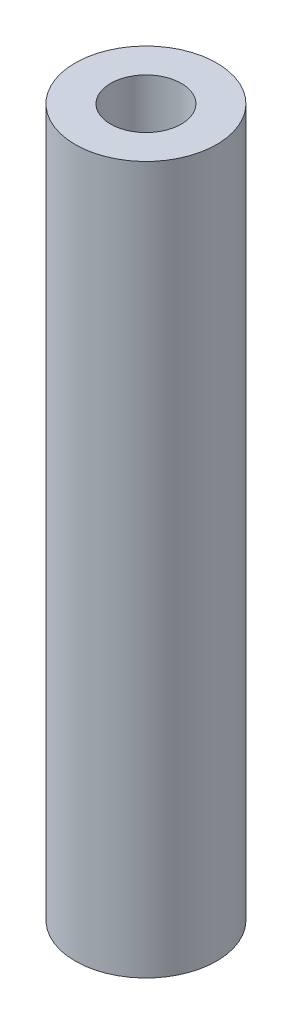
ISO-10303-21;
HEADER;
FILE_DESCRIPTION(('STEP AP214'),'2;1');
FILE_NAME('part.step','',(''),(''),'','','');
FILE_SCHEMA(('AUTOMOTIVE_DESIGN { 1 0 10303 214 1 1 1 1 }'));
ENDSEC;
DATA;
#1=APPLICATION_CONTEXT('core data for automotive mechanical design processes');
#2=APPLICATION_PROTOCOL_DEFINITION('international standard','automotive_design',2000,#1);
#3=PRODUCT_CONTEXT('',#1,'mechanical');
#4=PRODUCT('Part','Part','',(#3));
#5=PRODUCT_RELATED_PRODUCT_CATEGORY('part','',(#4));
#6=PRODUCT_DEFINITION_FORMATION('','',#4);
#7=PRODUCT_DEFINITION_CONTEXT('part definition',#1,'design');
#8=PRODUCT_DEFINITION('design','',#6,#7);
#9=PRODUCT_DEFINITION_SHAPE('','',#8);
#10=(LENGTH_UNIT() NAMED_UNIT(*) SI_UNIT(.MILLI.,.METRE.));
#11=(NAMED_UNIT(*) PLANE_ANGLE_UNIT() SI_UNIT($,.RADIAN.));
#12=(NAMED_UNIT(*) SI_UNIT($,.STERADIAN.) SOLID_ANGLE_UNIT());
#13=UNCERTAINTY_MEASURE_WITH_UNIT(LENGTH_MEASURE(1.E-05),#10,'distance_accuracy_value','');
#14=(GEOMETRIC_REPRESENTATION_CONTEXT(3) GLOBAL_UNCERTAINTY_ASSIGNED_CONTEXT((#13)) GLOBAL_UNIT_ASSIGNED_CONTEXT((#10,
#11,#12)) REPRESENTATION_CONTEXT('',''));
#15=CARTESIAN_POINT('',(0.,0.,0.));
#16=DIRECTION('',(0.,0.,1.));
#17=DIRECTION('',(1.,0.,0.));
#18=AXIS2_PLACEMENT_3D('',#15,#16,#17);
#19=CARTESIAN_POINT('',(0.,20.,0.));
#20=DIRECTION('',(0.,1.,0.));
#21=DIRECTION('',(0.,0.,1.));
#22=AXIS2_PLACEMENT_3D('',#19,#20,#21);
#23=PLANE('',#22);
#24=CARTESIAN_POINT('',(0.,20.,0.));
#25=DIRECTION('',(0.,1.,0.));
#26=DIRECTION('',(0.,0.,1.));
#27=AXIS2_PLACEMENT_3D('',#24,#25,#26);
#28=CIRCLE('',#27,2.);
#29=CARTESIAN_POINT('',(0.,20.,2.));
#30=VERTEX_POINT('',#29);
#31=EDGE_CURVE('E10',#30,#30,#28,.T.);
#32=ORIENTED_EDGE('',*,*,#31,.T.);
#33=EDGE_LOOP('',(#32));
#34=FACE_BOUND('',#33,.T.);
#35=CARTESIAN_POINT('',(0.,20.,0.));
#36=DIRECTION('',(0.,1.,0.));
#37=DIRECTION('',(0.,0.,1.));
#38=AXIS2_PLACEMENT_3D('',#35,#36,#37);
#39=CIRCLE('',#38,1.);
#40=CARTESIAN_POINT('',(0.,20.,1.));
#41=VERTEX_POINT('',#40);
#42=EDGE_CURVE('E47',#41,#41,#39,.T.);
#43=ORIENTED_EDGE('',*,*,#42,.F.);
#44=EDGE_LOOP('',(#43));
#45=FACE_BOUND('',#44,.T.);
#46=ADVANCED_FACE('F36',(#34,#45),#23,.T.);
#47=CARTESIAN_POINT('',(0.,0.,0.));
#48=DIRECTION('',(0.,1.,0.));
#49=DIRECTION('',(0.,0.,1.));
#50=AXIS2_PLACEMENT_3D('',#47,#48,#49);
#51=PLANE('',#50);
#52=CARTESIAN_POINT('',(0.,0.,0.));
#53=DIRECTION('',(0.,1.,0.));
#54=DIRECTION('',(0.,0.,1.));
#55=AXIS2_PLACEMENT_3D('',#52,#53,#54);
#56=CIRCLE('',#55,2.);
#57=CARTESIAN_POINT('',(0.,0.,2.));
#58=VERTEX_POINT('',#57);
#59=EDGE_CURVE('E40',#58,#58,#56,.T.);
#60=ORIENTED_EDGE('',*,*,#59,.F.);
#61=EDGE_LOOP('',(#60));
#62=FACE_BOUND('',#61,.T.);
#63=CARTESIAN_POINT('',(0.,0.,0.));
#64=DIRECTION('',(0.,1.,0.));
#65=DIRECTION('',(0.,0.,1.));
#66=AXIS2_PLACEMENT_3D('',#63,#64,#65);
#67=CIRCLE('',#66,1.);
#68=CARTESIAN_POINT('',(0.,0.,1.));
#69=VERTEX_POINT('',#68);
#70=EDGE_CURVE('E49',#69,#69,#67,.T.);
#71=ORIENTED_EDGE('',*,*,#70,.T.);
#72=EDGE_LOOP('',(#71));
#73=FACE_BOUND('',#72,.T.);
#74=ADVANCED_FACE('F59',(#62,#73),#51,.F.);
#75=CARTESIAN_POINT('',(0.,20.,0.));
#76=DIRECTION('',(0.,-1.,0.));
#77=DIRECTION('',(0.,0.,-1.));
#78=AXIS2_PLACEMENT_3D('',#75,#76,#77);
#79=CYLINDRICAL_SURFACE('',#78,2.);
#80=ORIENTED_EDGE('',*,*,#31,.F.);
#81=EDGE_LOOP('',(#80));
#82=FACE_BOUND('',#81,.T.);
#83=ORIENTED_EDGE('',*,*,#59,.T.);
#84=EDGE_LOOP('',(#83));
#85=FACE_BOUND('',#84,.T.);
#86=ADVANCED_FACE('F38',(#82,#85),#79,.T.);
#87=CARTESIAN_POINT('',(0.,20.,0.));
#88=DIRECTION('',(0.,-1.,0.));
#89=DIRECTION('',(0.,0.,-1.));
#90=AXIS2_PLACEMENT_3D('',#87,#88,#89);
#91=CYLINDRICAL_SURFACE('',#90,1.);
#92=ORIENTED_EDGE('',*,*,#42,.T.);
#93=EDGE_LOOP('',(#92));
#94=FACE_BOUND('',#93,.T.);
#95=ORIENTED_EDGE('',*,*,#70,.F.);
#96=EDGE_LOOP('',(#95));
#97=FACE_BOUND('',#96,.T.);
#98=ADVANCED_FACE('F55',(#94,#97),#91,.F.);
#99=CLOSED_SHELL('',(#46,#74,#86,#98));
#100=MANIFOLD_SOLID_BREP('B2',#99);
#101=ADVANCED_BREP_SHAPE_REPRESENTATION('',(#18,#100),#14);
#102=SHAPE_DEFINITION_REPRESENTATION(#9,#101);
ENDSEC;
END-ISO-10303-21;
